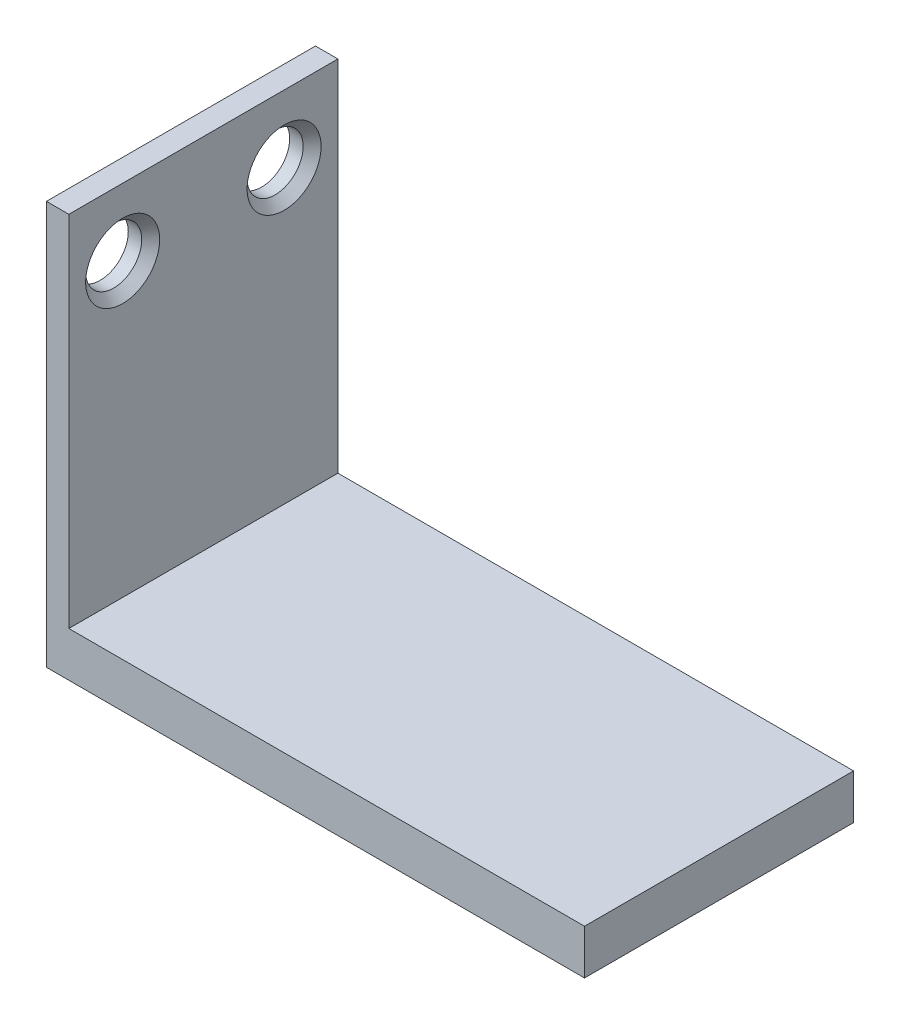
ISO-10303-21;
HEADER;
FILE_DESCRIPTION(('STEP AP214'),'2;1');
FILE_NAME('part.step','',(''),(''),'','','');
FILE_SCHEMA(('AUTOMOTIVE_DESIGN { 1 0 10303 214 1 1 1 1 }'));
ENDSEC;
DATA;
#1=APPLICATION_CONTEXT('core data for automotive mechanical design processes');
#2=APPLICATION_PROTOCOL_DEFINITION('international standard','automotive_design',2000,#1);
#3=PRODUCT_CONTEXT('',#1,'mechanical');
#4=PRODUCT('Part','Part','',(#3));
#5=PRODUCT_RELATED_PRODUCT_CATEGORY('part','',(#4));
#6=PRODUCT_DEFINITION_FORMATION('','',#4);
#7=PRODUCT_DEFINITION_CONTEXT('part definition',#1,'design');
#8=PRODUCT_DEFINITION('design','',#6,#7);
#9=PRODUCT_DEFINITION_SHAPE('','',#8);
#10=(LENGTH_UNIT() NAMED_UNIT(*) SI_UNIT(.MILLI.,.METRE.));
#11=(NAMED_UNIT(*) PLANE_ANGLE_UNIT() SI_UNIT($,.RADIAN.));
#12=(NAMED_UNIT(*) SI_UNIT($,.STERADIAN.) SOLID_ANGLE_UNIT());
#13=UNCERTAINTY_MEASURE_WITH_UNIT(LENGTH_MEASURE(1.E-05),#10,'distance_accuracy_value','');
#14=(GEOMETRIC_REPRESENTATION_CONTEXT(3) GLOBAL_UNCERTAINTY_ASSIGNED_CONTEXT((#13)) GLOBAL_UNIT_ASSIGNED_CONTEXT((#10,
#11,#12)) REPRESENTATION_CONTEXT('',''));
#15=CARTESIAN_POINT('',(0.,0.,0.));
#16=DIRECTION('',(0.,0.,1.));
#17=DIRECTION('',(1.,0.,0.));
#18=AXIS2_PLACEMENT_3D('',#15,#16,#17);
#19=CARTESIAN_POINT('',(-6.,1.,3.));
#20=DIRECTION('',(0.,0.,-1.));
#21=DIRECTION('',(-1.,0.,0.));
#22=AXIS2_PLACEMENT_3D('',#19,#20,#21);
#23=PLANE('',#22);
#24=DIRECTION('',(1.,0.,0.));
#25=VECTOR('',#24,1.);
#26=CARTESIAN_POINT('',(-6.,0.,3.));
#27=LINE('',#26,#25);
#28=CARTESIAN_POINT('',(-6.,0.,3.));
#29=VERTEX_POINT('',#28);
#30=CARTESIAN_POINT('',(6.,0.,3.));
#31=VERTEX_POINT('',#30);
#32=EDGE_CURVE('E83',#29,#31,#27,.T.);
#33=ORIENTED_EDGE('',*,*,#32,.T.);
#34=DIRECTION('',(0.,-1.,0.));
#35=VECTOR('',#34,1.);
#36=CARTESIAN_POINT('',(6.,1.,3.));
#37=LINE('',#36,#35);
#38=CARTESIAN_POINT('',(6.,1.,3.));
#39=VERTEX_POINT('',#38);
#40=EDGE_CURVE('E11',#39,#31,#37,.T.);
#41=ORIENTED_EDGE('',*,*,#40,.F.);
#42=DIRECTION('',(1.,0.,0.));
#43=VECTOR('',#42,1.);
#44=CARTESIAN_POINT('',(-6.,1.,3.));
#45=LINE('',#44,#43);
#46=CARTESIAN_POINT('',(-5.5,1.,3.));
#47=VERTEX_POINT('',#46);
#48=EDGE_CURVE('E106',#47,#39,#45,.T.);
#49=ORIENTED_EDGE('',*,*,#48,.F.);
#50=DIRECTION('',(0.,-1.,0.));
#51=VECTOR('',#50,1.);
#52=CARTESIAN_POINT('',(-5.5,9.,3.));
#53=LINE('',#52,#51);
#54=CARTESIAN_POINT('',(-5.5,9.,3.));
#55=VERTEX_POINT('',#54);
#56=EDGE_CURVE('E101',#55,#47,#53,.T.);
#57=ORIENTED_EDGE('',*,*,#56,.F.);
#58=DIRECTION('',(1.,0.,0.));
#59=VECTOR('',#58,1.);
#60=CARTESIAN_POINT('',(-6.,9.,3.));
#61=LINE('',#60,#59);
#62=CARTESIAN_POINT('',(-6.,9.,3.));
#63=VERTEX_POINT('',#62);
#64=EDGE_CURVE('E87',#63,#55,#61,.T.);
#65=ORIENTED_EDGE('',*,*,#64,.F.);
#66=DIRECTION('',(0.,-1.,0.));
#67=VECTOR('',#66,1.);
#68=CARTESIAN_POINT('',(-6.,1.,3.));
#69=LINE('',#68,#67);
#70=EDGE_CURVE('E80',#63,#29,#69,.T.);
#71=ORIENTED_EDGE('',*,*,#70,.T.);
#72=EDGE_LOOP('',(#33,#41,#49,#57,#65,#71));
#73=FACE_BOUND('',#72,.T.);
#74=ADVANCED_FACE('F39',(#73),#23,.F.);
#75=CARTESIAN_POINT('',(6.,1.,3.));
#76=DIRECTION('',(-1.,0.,0.));
#77=DIRECTION('',(0.,0.,1.));
#78=AXIS2_PLACEMENT_3D('',#75,#76,#77);
#79=PLANE('',#78);
#80=DIRECTION('',(0.,0.,-1.));
#81=VECTOR('',#80,1.);
#82=CARTESIAN_POINT('',(6.,0.,3.));
#83=LINE('',#82,#81);
#84=CARTESIAN_POINT('',(6.,0.,-3.));
#85=VERTEX_POINT('',#84);
#86=EDGE_CURVE('E100',#31,#85,#83,.T.);
#87=ORIENTED_EDGE('',*,*,#86,.T.);
#88=DIRECTION('',(0.,-1.,0.));
#89=VECTOR('',#88,1.);
#90=CARTESIAN_POINT('',(6.,1.,-3.));
#91=LINE('',#90,#89);
#92=CARTESIAN_POINT('',(6.,1.,-3.));
#93=VERTEX_POINT('',#92);
#94=EDGE_CURVE('E46',#93,#85,#91,.T.);
#95=ORIENTED_EDGE('',*,*,#94,.F.);
#96=DIRECTION('',(0.,0.,-1.));
#97=VECTOR('',#96,1.);
#98=CARTESIAN_POINT('',(6.,1.,3.));
#99=LINE('',#98,#97);
#100=EDGE_CURVE('E109',#39,#93,#99,.T.);
#101=ORIENTED_EDGE('',*,*,#100,.F.);
#102=ORIENTED_EDGE('',*,*,#40,.T.);
#103=EDGE_LOOP('',(#87,#95,#101,#102));
#104=FACE_BOUND('',#103,.T.);
#105=ADVANCED_FACE('F118',(#104),#79,.F.);
#106=CARTESIAN_POINT('',(-6.,1.,-3.));
#107=DIRECTION('',(0.,0.,-1.));
#108=DIRECTION('',(-1.,0.,0.));
#109=AXIS2_PLACEMENT_3D('',#106,#107,#108);
#110=PLANE('',#109);
#111=DIRECTION('',(1.,0.,0.));
#112=VECTOR('',#111,1.);
#113=CARTESIAN_POINT('',(-6.,0.,-3.));
#114=LINE('',#113,#112);
#115=CARTESIAN_POINT('',(-6.,0.,-3.));
#116=VERTEX_POINT('',#115);
#117=EDGE_CURVE('E107',#116,#85,#114,.T.);
#118=ORIENTED_EDGE('',*,*,#117,.F.);
#119=DIRECTION('',(0.,-1.,0.));
#120=VECTOR('',#119,1.);
#121=CARTESIAN_POINT('',(-6.,1.,-3.));
#122=LINE('',#121,#120);
#123=CARTESIAN_POINT('',(-6.,9.,-3.));
#124=VERTEX_POINT('',#123);
#125=EDGE_CURVE('E92',#124,#116,#122,.T.);
#126=ORIENTED_EDGE('',*,*,#125,.F.);
#127=DIRECTION('',(-1.,0.,0.));
#128=VECTOR('',#127,1.);
#129=CARTESIAN_POINT('',(-6.,9.,-3.));
#130=LINE('',#129,#128);
#131=CARTESIAN_POINT('',(-5.5,9.,-3.));
#132=VERTEX_POINT('',#131);
#133=EDGE_CURVE('E126',#132,#124,#130,.T.);
#134=ORIENTED_EDGE('',*,*,#133,.F.);
#135=DIRECTION('',(0.,-1.,0.));
#136=VECTOR('',#135,1.);
#137=CARTESIAN_POINT('',(-5.5,9.,-3.));
#138=LINE('',#137,#136);
#139=CARTESIAN_POINT('',(-5.5,1.,-3.));
#140=VERTEX_POINT('',#139);
#141=EDGE_CURVE('E124',#132,#140,#138,.T.);
#142=ORIENTED_EDGE('',*,*,#141,.T.);
#143=DIRECTION('',(1.,0.,0.));
#144=VECTOR('',#143,1.);
#145=CARTESIAN_POINT('',(-6.,1.,-3.));
#146=LINE('',#145,#144);
#147=EDGE_CURVE('E61',#140,#93,#146,.T.);
#148=ORIENTED_EDGE('',*,*,#147,.T.);
#149=ORIENTED_EDGE('',*,*,#94,.T.);
#150=EDGE_LOOP('',(#118,#126,#134,#142,#148,#149));
#151=FACE_BOUND('',#150,.T.);
#152=ADVANCED_FACE('F115',(#151),#110,.T.);
#153=CARTESIAN_POINT('',(-6.,1.,3.));
#154=DIRECTION('',(-1.,0.,0.));
#155=DIRECTION('',(0.,0.,1.));
#156=AXIS2_PLACEMENT_3D('',#153,#154,#155);
#157=PLANE('',#156);
#158=CARTESIAN_POINT('',(-6.,7.5,-1.8));
#159=DIRECTION('',(1.,0.,0.));
#160=DIRECTION('',(0.,0.,-1.));
#161=AXIS2_PLACEMENT_3D('',#158,#159,#160);
#162=CIRCLE('',#161,0.625000000000001);
#163=CARTESIAN_POINT('',(-6.,7.5,-2.425));
#164=VERTEX_POINT('',#163);
#165=EDGE_CURVE('E145',#164,#164,#162,.T.);
#166=ORIENTED_EDGE('',*,*,#165,.T.);
#167=EDGE_LOOP('',(#166));
#168=FACE_BOUND('',#167,.T.);
#169=CARTESIAN_POINT('',(-6.,7.5,1.8));
#170=DIRECTION('',(1.,0.,0.));
#171=DIRECTION('',(0.,0.,-1.));
#172=AXIS2_PLACEMENT_3D('',#169,#170,#171);
#173=CIRCLE('',#172,0.625000000000001);
#174=CARTESIAN_POINT('',(-6.,7.5,1.175));
#175=VERTEX_POINT('',#174);
#176=EDGE_CURVE('E129',#175,#175,#173,.T.);
#177=ORIENTED_EDGE('',*,*,#176,.T.);
#178=EDGE_LOOP('',(#177));
#179=FACE_BOUND('',#178,.T.);
#180=DIRECTION('',(0.,0.,-1.));
#181=VECTOR('',#180,1.);
#182=CARTESIAN_POINT('',(-6.,0.,3.));
#183=LINE('',#182,#181);
#184=EDGE_CURVE('E98',#29,#116,#183,.T.);
#185=ORIENTED_EDGE('',*,*,#184,.F.);
#186=ORIENTED_EDGE('',*,*,#70,.F.);
#187=DIRECTION('',(0.,0.,1.));
#188=VECTOR('',#187,1.);
#189=CARTESIAN_POINT('',(-6.,9.,-3.));
#190=LINE('',#189,#188);
#191=EDGE_CURVE('E128',#124,#63,#190,.T.);
#192=ORIENTED_EDGE('',*,*,#191,.F.);
#193=ORIENTED_EDGE('',*,*,#125,.T.);
#194=EDGE_LOOP('',(#185,#186,#192,#193));
#195=FACE_BOUND('',#194,.T.);
#196=ADVANCED_FACE('F103',(#168,#179,#195),#157,.T.);
#197=CARTESIAN_POINT('',(0.,1.,0.));
#198=DIRECTION('',(0.,1.,0.));
#199=DIRECTION('',(0.,0.,1.));
#200=AXIS2_PLACEMENT_3D('',#197,#198,#199);
#201=PLANE('',#200);
#202=DIRECTION('',(0.,0.,-1.));
#203=VECTOR('',#202,1.);
#204=CARTESIAN_POINT('',(-5.5,1.,-3.));
#205=LINE('',#204,#203);
#206=EDGE_CURVE('E53',#47,#140,#205,.T.);
#207=ORIENTED_EDGE('',*,*,#206,.F.);
#208=ORIENTED_EDGE('',*,*,#48,.T.);
#209=ORIENTED_EDGE('',*,*,#100,.T.);
#210=ORIENTED_EDGE('',*,*,#147,.F.);
#211=EDGE_LOOP('',(#207,#208,#209,#210));
#212=FACE_BOUND('',#211,.T.);
#213=ADVANCED_FACE('F175',(#212),#201,.T.);
#214=CARTESIAN_POINT('',(0.,0.,0.));
#215=DIRECTION('',(0.,1.,0.));
#216=DIRECTION('',(0.,0.,1.));
#217=AXIS2_PLACEMENT_3D('',#214,#215,#216);
#218=PLANE('',#217);
#219=ORIENTED_EDGE('',*,*,#32,.F.);
#220=ORIENTED_EDGE('',*,*,#184,.T.);
#221=ORIENTED_EDGE('',*,*,#117,.T.);
#222=ORIENTED_EDGE('',*,*,#86,.F.);
#223=EDGE_LOOP('',(#219,#220,#221,#222));
#224=FACE_BOUND('',#223,.T.);
#225=ADVANCED_FACE('F96',(#224),#218,.F.);
#226=CARTESIAN_POINT('',(-5.5,9.,-3.));
#227=DIRECTION('',(-1.,0.,0.));
#228=DIRECTION('',(0.,0.,1.));
#229=AXIS2_PLACEMENT_3D('',#226,#227,#228);
#230=PLANE('',#229);
#231=CARTESIAN_POINT('',(-5.5,7.5,-1.8));
#232=DIRECTION('',(1.,0.,0.));
#233=DIRECTION('',(0.,0.,-1.));
#234=AXIS2_PLACEMENT_3D('',#231,#232,#233);
#235=CIRCLE('',#234,0.824999999999999);
#236=CARTESIAN_POINT('',(-5.5,7.5,-2.625));
#237=VERTEX_POINT('',#236);
#238=EDGE_CURVE('E151',#237,#237,#235,.T.);
#239=ORIENTED_EDGE('',*,*,#238,.F.);
#240=EDGE_LOOP('',(#239));
#241=FACE_BOUND('',#240,.T.);
#242=CARTESIAN_POINT('',(-5.5,7.5,1.8));
#243=DIRECTION('',(1.,0.,0.));
#244=DIRECTION('',(0.,0.,-1.));
#245=AXIS2_PLACEMENT_3D('',#242,#243,#244);
#246=CIRCLE('',#245,0.824999999999999);
#247=CARTESIAN_POINT('',(-5.5,7.5,0.975000000000001));
#248=VERTEX_POINT('',#247);
#249=EDGE_CURVE('E142',#248,#248,#246,.T.);
#250=ORIENTED_EDGE('',*,*,#249,.F.);
#251=EDGE_LOOP('',(#250));
#252=FACE_BOUND('',#251,.T.);
#253=ORIENTED_EDGE('',*,*,#206,.T.);
#254=ORIENTED_EDGE('',*,*,#141,.F.);
#255=DIRECTION('',(0.,0.,-1.));
#256=VECTOR('',#255,1.);
#257=CARTESIAN_POINT('',(-5.5,9.,-3.));
#258=LINE('',#257,#256);
#259=EDGE_CURVE('E132',#55,#132,#258,.T.);
#260=ORIENTED_EDGE('',*,*,#259,.F.);
#261=ORIENTED_EDGE('',*,*,#56,.T.);
#262=EDGE_LOOP('',(#253,#254,#260,#261));
#263=FACE_BOUND('',#262,.T.);
#264=ADVANCED_FACE('F157',(#241,#252,#263),#230,.F.);
#265=CARTESIAN_POINT('',(0.,9.,0.));
#266=DIRECTION('',(0.,1.,0.));
#267=DIRECTION('',(0.,0.,1.));
#268=AXIS2_PLACEMENT_3D('',#265,#266,#267);
#269=PLANE('',#268);
#270=ORIENTED_EDGE('',*,*,#191,.T.);
#271=ORIENTED_EDGE('',*,*,#64,.T.);
#272=ORIENTED_EDGE('',*,*,#259,.T.);
#273=ORIENTED_EDGE('',*,*,#133,.T.);
#274=EDGE_LOOP('',(#270,#271,#272,#273));
#275=FACE_BOUND('',#274,.T.);
#276=ADVANCED_FACE('F160',(#275),#269,.T.);
#277=CARTESIAN_POINT('',(-5.5,7.5,1.8));
#278=DIRECTION('',(1.,0.,0.));
#279=DIRECTION('',(0.,0.,-1.));
#280=AXIS2_PLACEMENT_3D('',#277,#278,#279);
#281=CYLINDRICAL_SURFACE('',#280,0.625000000000001);
#282=ORIENTED_EDGE('',*,*,#176,.F.);
#283=EDGE_LOOP('',(#282));
#284=FACE_BOUND('',#283,.T.);
#285=CARTESIAN_POINT('',(-5.7,7.5,1.8));
#286=DIRECTION('',(1.,0.,0.));
#287=DIRECTION('',(0.,0.,-1.));
#288=AXIS2_PLACEMENT_3D('',#285,#286,#287);
#289=CIRCLE('',#288,0.625000000000001);
#290=CARTESIAN_POINT('',(-5.7,7.5,1.175));
#291=VERTEX_POINT('',#290);
#292=EDGE_CURVE('E139',#291,#291,#289,.T.);
#293=ORIENTED_EDGE('',*,*,#292,.T.);
#294=EDGE_LOOP('',(#293));
#295=FACE_BOUND('',#294,.T.);
#296=ADVANCED_FACE('F227',(#284,#295),#281,.F.);
#297=CARTESIAN_POINT('',(-5.5,7.5,1.8));
#298=DIRECTION('',(1.,0.,0.));
#299=DIRECTION('',(0.,0.,-1.));
#300=AXIS2_PLACEMENT_3D('',#297,#298,#299);
#301=CONICAL_SURFACE('',#300,0.824999999999999,0.785398163397446);
#302=ORIENTED_EDGE('',*,*,#292,.F.);
#303=EDGE_LOOP('',(#302));
#304=FACE_BOUND('',#303,.T.);
#305=ORIENTED_EDGE('',*,*,#249,.T.);
#306=EDGE_LOOP('',(#305));
#307=FACE_BOUND('',#306,.T.);
#308=ADVANCED_FACE('F235',(#304,#307),#301,.F.);
#309=CARTESIAN_POINT('',(-5.5,7.5,-1.8));
#310=DIRECTION('',(1.,0.,0.));
#311=DIRECTION('',(0.,0.,-1.));
#312=AXIS2_PLACEMENT_3D('',#309,#310,#311);
#313=CYLINDRICAL_SURFACE('',#312,0.625000000000001);
#314=ORIENTED_EDGE('',*,*,#165,.F.);
#315=EDGE_LOOP('',(#314));
#316=FACE_BOUND('',#315,.T.);
#317=CARTESIAN_POINT('',(-5.7,7.5,-1.8));
#318=DIRECTION('',(1.,0.,0.));
#319=DIRECTION('',(0.,0.,-1.));
#320=AXIS2_PLACEMENT_3D('',#317,#318,#319);
#321=CIRCLE('',#320,0.625000000000001);
#322=CARTESIAN_POINT('',(-5.7,7.5,-2.425));
#323=VERTEX_POINT('',#322);
#324=EDGE_CURVE('E148',#323,#323,#321,.T.);
#325=ORIENTED_EDGE('',*,*,#324,.T.);
#326=EDGE_LOOP('',(#325));
#327=FACE_BOUND('',#326,.T.);
#328=ADVANCED_FACE('F245',(#316,#327),#313,.F.);
#329=CARTESIAN_POINT('',(-5.5,7.5,-1.8));
#330=DIRECTION('',(1.,0.,0.));
#331=DIRECTION('',(0.,0.,-1.));
#332=AXIS2_PLACEMENT_3D('',#329,#330,#331);
#333=CONICAL_SURFACE('',#332,0.824999999999999,0.785398163397446);
#334=ORIENTED_EDGE('',*,*,#324,.F.);
#335=EDGE_LOOP('',(#334));
#336=FACE_BOUND('',#335,.T.);
#337=ORIENTED_EDGE('',*,*,#238,.T.);
#338=EDGE_LOOP('',(#337));
#339=FACE_BOUND('',#338,.T.);
#340=ADVANCED_FACE('F155',(#336,#339),#333,.F.);
#341=CLOSED_SHELL('',(#74,#105,#152,#196,#213,#225,#264,#276,#296,#308,#328,#340));
#342=MANIFOLD_SOLID_BREP('B2',#341);
#343=ADVANCED_BREP_SHAPE_REPRESENTATION('',(#18,#342),#14);
#344=SHAPE_DEFINITION_REPRESENTATION(#9,#343);
ENDSEC;
END-ISO-10303-21;
